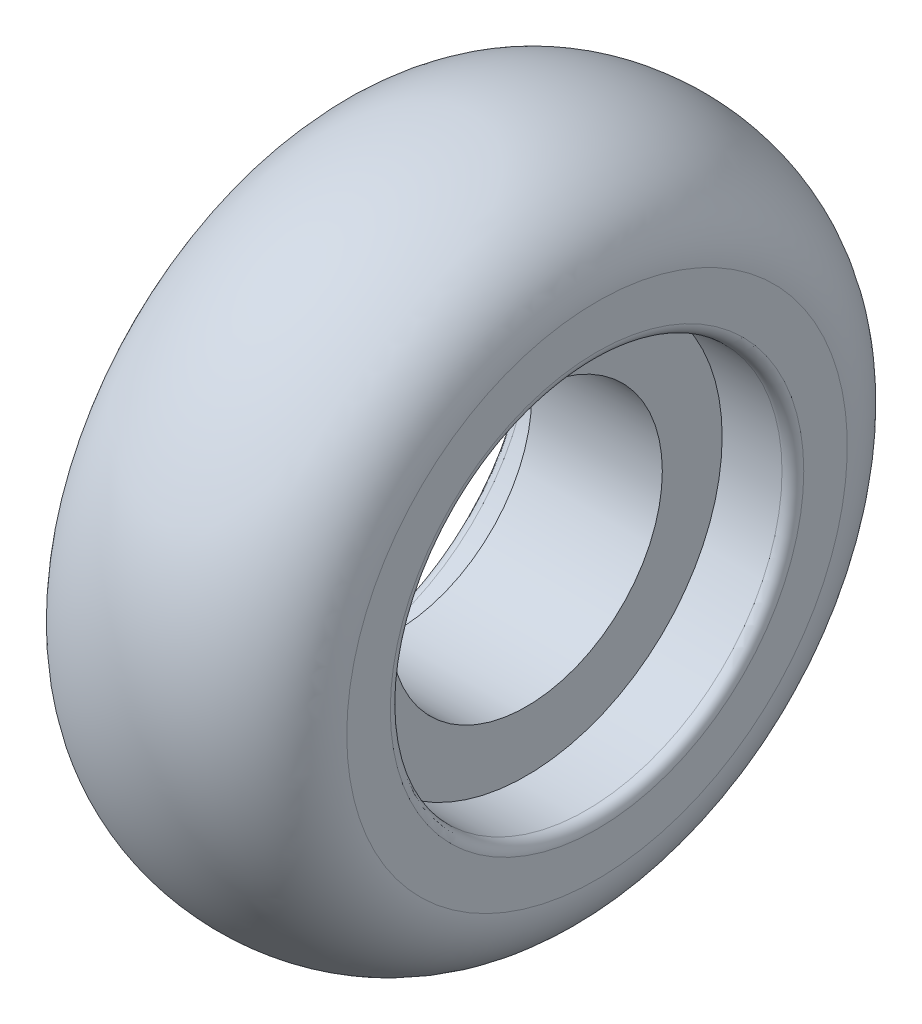
ISO-10303-21;
HEADER;
FILE_DESCRIPTION(('STEP AP214'),'2;1');
FILE_NAME('part.step','',(''),(''),'','','');
FILE_SCHEMA(('AUTOMOTIVE_DESIGN { 1 0 10303 214 1 1 1 1 }'));
ENDSEC;
DATA;
#1=APPLICATION_CONTEXT('core data for automotive mechanical design processes');
#2=APPLICATION_PROTOCOL_DEFINITION('international standard','automotive_design',2000,#1);
#3=PRODUCT_CONTEXT('',#1,'mechanical');
#4=PRODUCT('Part','Part','',(#3));
#5=PRODUCT_RELATED_PRODUCT_CATEGORY('part','',(#4));
#6=PRODUCT_DEFINITION_FORMATION('','',#4);
#7=PRODUCT_DEFINITION_CONTEXT('part definition',#1,'design');
#8=PRODUCT_DEFINITION('design','',#6,#7);
#9=PRODUCT_DEFINITION_SHAPE('','',#8);
#10=(LENGTH_UNIT() NAMED_UNIT(*) SI_UNIT(.MILLI.,.METRE.));
#11=(NAMED_UNIT(*) PLANE_ANGLE_UNIT() SI_UNIT($,.RADIAN.));
#12=(NAMED_UNIT(*) SI_UNIT($,.STERADIAN.) SOLID_ANGLE_UNIT());
#13=UNCERTAINTY_MEASURE_WITH_UNIT(LENGTH_MEASURE(1.E-05),#10,'distance_accuracy_value','');
#14=(GEOMETRIC_REPRESENTATION_CONTEXT(3) GLOBAL_UNCERTAINTY_ASSIGNED_CONTEXT((#13)) GLOBAL_UNIT_ASSIGNED_CONTEXT((#10,
#11,#12)) REPRESENTATION_CONTEXT('',''));
#15=CARTESIAN_POINT('',(0.,0.,0.));
#16=DIRECTION('',(0.,0.,1.));
#17=DIRECTION('',(1.,0.,0.));
#18=AXIS2_PLACEMENT_3D('',#15,#16,#17);
#19=CARTESIAN_POINT('',(6.,12.5,0.));
#20=DIRECTION('',(-1.,0.,0.));
#21=DIRECTION('',(0.,0.,1.));
#22=AXIS2_PLACEMENT_3D('',#19,#20,#21);
#23=PLANE('',#22);
#24=CARTESIAN_POINT('',(6.,0.,0.));
#25=DIRECTION('',(-1.,0.,0.));
#26=DIRECTION('',(0.,0.,1.));
#27=AXIS2_PLACEMENT_3D('',#24,#25,#26);
#28=CIRCLE('',#27,18.);
#29=CARTESIAN_POINT('',(6.,0.,18.));
#30=VERTEX_POINT('',#29);
#31=EDGE_CURVE('E10',#30,#30,#28,.T.);
#32=ORIENTED_EDGE('',*,*,#31,.F.);
#33=EDGE_LOOP('',(#32));
#34=FACE_BOUND('',#33,.T.);
#35=CARTESIAN_POINT('',(6.,0.,0.));
#36=DIRECTION('',(-1.,0.,0.));
#37=DIRECTION('',(0.,0.,1.));
#38=AXIS2_PLACEMENT_3D('',#35,#36,#37);
#39=CIRCLE('',#38,12.5);
#40=CARTESIAN_POINT('',(6.,0.,12.5));
#41=VERTEX_POINT('',#40);
#42=EDGE_CURVE('E67',#41,#41,#39,.T.);
#43=ORIENTED_EDGE('',*,*,#42,.T.);
#44=EDGE_LOOP('',(#43));
#45=FACE_BOUND('',#44,.T.);
#46=ADVANCED_FACE('F33',(#34,#45),#23,.F.);
#47=CARTESIAN_POINT('',(0.,0.,0.));
#48=DIRECTION('',(-1.,0.,0.));
#49=DIRECTION('',(0.,0.,1.));
#50=AXIS2_PLACEMENT_3D('',#47,#48,#49);
#51=CYLINDRICAL_SURFACE('',#50,18.);
#52=CARTESIAN_POINT('',(11.5,0.,0.));
#53=DIRECTION('',(-1.,0.,0.));
#54=DIRECTION('',(0.,0.,1.));
#55=AXIS2_PLACEMENT_3D('',#52,#53,#54);
#56=CIRCLE('',#55,18.);
#57=CARTESIAN_POINT('',(11.5,0.,18.));
#58=VERTEX_POINT('',#57);
#59=EDGE_CURVE('E39',#58,#58,#56,.T.);
#60=ORIENTED_EDGE('',*,*,#59,.F.);
#61=EDGE_LOOP('',(#60));
#62=FACE_BOUND('',#61,.T.);
#63=ORIENTED_EDGE('',*,*,#31,.T.);
#64=EDGE_LOOP('',(#63));
#65=FACE_BOUND('',#64,.T.);
#66=ADVANCED_FACE('F85',(#62,#65),#51,.F.);
#67=CARTESIAN_POINT('',(11.5,0.,0.));
#68=DIRECTION('',(-1.,0.,0.));
#69=DIRECTION('',(0.,0.,1.));
#70=AXIS2_PLACEMENT_3D('',#67,#68,#69);
#71=TOROIDAL_SURFACE('',#70,19.,1.);
#72=CARTESIAN_POINT('',(12.5,0.,0.));
#73=DIRECTION('',(-1.,0.,0.));
#74=DIRECTION('',(0.,0.,1.));
#75=AXIS2_PLACEMENT_3D('',#72,#73,#74);
#76=CIRCLE('',#75,19.);
#77=CARTESIAN_POINT('',(12.5,0.,19.));
#78=VERTEX_POINT('',#77);
#79=EDGE_CURVE('E43',#78,#78,#76,.T.);
#80=ORIENTED_EDGE('',*,*,#79,.F.);
#81=EDGE_LOOP('',(#80));
#82=FACE_BOUND('',#81,.T.);
#83=ORIENTED_EDGE('',*,*,#59,.T.);
#84=EDGE_LOOP('',(#83));
#85=FACE_BOUND('',#84,.T.);
#86=ADVANCED_FACE('F82',(#82,#85),#71,.T.);
#87=CARTESIAN_POINT('',(12.5,19.,0.));
#88=DIRECTION('',(-1.,0.,0.));
#89=DIRECTION('',(0.,0.,1.));
#90=AXIS2_PLACEMENT_3D('',#87,#88,#89);
#91=PLANE('',#90);
#92=CARTESIAN_POINT('',(12.5,0.,0.));
#93=DIRECTION('',(-1.,0.,0.));
#94=DIRECTION('',(0.,0.,1.));
#95=AXIS2_PLACEMENT_3D('',#92,#93,#94);
#96=CIRCLE('',#95,23.);
#97=CARTESIAN_POINT('',(12.5,0.,23.));
#98=VERTEX_POINT('',#97);
#99=EDGE_CURVE('E47',#98,#98,#96,.T.);
#100=ORIENTED_EDGE('',*,*,#99,.F.);
#101=EDGE_LOOP('',(#100));
#102=FACE_BOUND('',#101,.T.);
#103=ORIENTED_EDGE('',*,*,#79,.T.);
#104=EDGE_LOOP('',(#103));
#105=FACE_BOUND('',#104,.T.);
#106=ADVANCED_FACE('F77',(#102,#105),#91,.F.);
#107=CARTESIAN_POINT('',(0.,23.,0.));
#108=DIRECTION('',(0.,0.,1.));
#109=DIRECTION('',(1.,0.,0.));
#110=AXIS2_PLACEMENT_3D('',#107,#108,#109);
#111=ELLIPSE('',#110,12.5,8.5);
#112=CARTESIAN_POINT('',(0.,0.,0.));
#113=DIRECTION('',(-1.,0.,0.));
#114=AXIS1_PLACEMENT('',#112,#113);
#115=SURFACE_OF_REVOLUTION('',#111,#114);
#116=CARTESIAN_POINT('',(-12.5,0.,0.));
#117=DIRECTION('',(-1.,0.,0.));
#118=DIRECTION('',(0.,0.,1.));
#119=AXIS2_PLACEMENT_3D('',#116,#117,#118);
#120=CIRCLE('',#119,23.);
#121=CARTESIAN_POINT('',(-12.5,0.,23.));
#122=VERTEX_POINT('',#121);
#123=EDGE_CURVE('E52',#122,#122,#120,.T.);
#124=ORIENTED_EDGE('',*,*,#123,.F.);
#125=EDGE_LOOP('',(#124));
#126=FACE_BOUND('',#125,.T.);
#127=ORIENTED_EDGE('',*,*,#99,.T.);
#128=EDGE_LOOP('',(#127));
#129=FACE_BOUND('',#128,.T.);
#130=ADVANCED_FACE('F72',(#126,#129),#115,.T.);
#131=CARTESIAN_POINT('',(-12.5,19.,0.));
#132=DIRECTION('',(1.,0.,0.));
#133=DIRECTION('',(0.,0.,-1.));
#134=AXIS2_PLACEMENT_3D('',#131,#132,#133);
#135=PLANE('',#134);
#136=CARTESIAN_POINT('',(-12.5,0.,0.));
#137=DIRECTION('',(-1.,0.,0.));
#138=DIRECTION('',(0.,0.,1.));
#139=AXIS2_PLACEMENT_3D('',#136,#137,#138);
#140=CIRCLE('',#139,19.);
#141=CARTESIAN_POINT('',(-12.5,0.,19.));
#142=VERTEX_POINT('',#141);
#143=EDGE_CURVE('E55',#142,#142,#140,.T.);
#144=ORIENTED_EDGE('',*,*,#143,.F.);
#145=EDGE_LOOP('',(#144));
#146=FACE_BOUND('',#145,.T.);
#147=ORIENTED_EDGE('',*,*,#123,.T.);
#148=EDGE_LOOP('',(#147));
#149=FACE_BOUND('',#148,.T.);
#150=ADVANCED_FACE('F76',(#146,#149),#135,.F.);
#151=CARTESIAN_POINT('',(-11.5,0.,0.));
#152=DIRECTION('',(-1.,0.,0.));
#153=DIRECTION('',(0.,0.,1.));
#154=AXIS2_PLACEMENT_3D('',#151,#152,#153);
#155=TOROIDAL_SURFACE('',#154,19.,1.);
#156=CARTESIAN_POINT('',(-11.5,0.,0.));
#157=DIRECTION('',(-1.,0.,0.));
#158=DIRECTION('',(0.,0.,1.));
#159=AXIS2_PLACEMENT_3D('',#156,#157,#158);
#160=CIRCLE('',#159,18.);
#161=CARTESIAN_POINT('',(-11.5,0.,18.));
#162=VERTEX_POINT('',#161);
#163=EDGE_CURVE('E58',#162,#162,#160,.T.);
#164=ORIENTED_EDGE('',*,*,#163,.F.);
#165=EDGE_LOOP('',(#164));
#166=FACE_BOUND('',#165,.T.);
#167=ORIENTED_EDGE('',*,*,#143,.T.);
#168=EDGE_LOOP('',(#167));
#169=FACE_BOUND('',#168,.T.);
#170=ADVANCED_FACE('F113',(#166,#169),#155,.T.);
#171=CARTESIAN_POINT('',(0.,0.,0.));
#172=DIRECTION('',(-1.,0.,0.));
#173=DIRECTION('',(0.,0.,1.));
#174=AXIS2_PLACEMENT_3D('',#171,#172,#173);
#175=CYLINDRICAL_SURFACE('',#174,18.);
#176=CARTESIAN_POINT('',(-6.,0.,0.));
#177=DIRECTION('',(-1.,0.,0.));
#178=DIRECTION('',(0.,0.,1.));
#179=AXIS2_PLACEMENT_3D('',#176,#177,#178);
#180=CIRCLE('',#179,18.);
#181=CARTESIAN_POINT('',(-6.,0.,18.));
#182=VERTEX_POINT('',#181);
#183=EDGE_CURVE('E61',#182,#182,#180,.T.);
#184=ORIENTED_EDGE('',*,*,#183,.F.);
#185=EDGE_LOOP('',(#184));
#186=FACE_BOUND('',#185,.T.);
#187=ORIENTED_EDGE('',*,*,#163,.T.);
#188=EDGE_LOOP('',(#187));
#189=FACE_BOUND('',#188,.T.);
#190=ADVANCED_FACE('F107',(#186,#189),#175,.F.);
#191=CARTESIAN_POINT('',(-6.,12.5,0.));
#192=DIRECTION('',(1.,0.,0.));
#193=DIRECTION('',(0.,0.,-1.));
#194=AXIS2_PLACEMENT_3D('',#191,#192,#193);
#195=PLANE('',#194);
#196=CARTESIAN_POINT('',(-6.,0.,0.));
#197=DIRECTION('',(-1.,0.,0.));
#198=DIRECTION('',(0.,0.,1.));
#199=AXIS2_PLACEMENT_3D('',#196,#197,#198);
#200=CIRCLE('',#199,12.5);
#201=CARTESIAN_POINT('',(-6.,0.,12.5));
#202=VERTEX_POINT('',#201);
#203=EDGE_CURVE('E64',#202,#202,#200,.T.);
#204=ORIENTED_EDGE('',*,*,#203,.F.);
#205=EDGE_LOOP('',(#204));
#206=FACE_BOUND('',#205,.T.);
#207=ORIENTED_EDGE('',*,*,#183,.T.);
#208=EDGE_LOOP('',(#207));
#209=FACE_BOUND('',#208,.T.);
#210=ADVANCED_FACE('F101',(#206,#209),#195,.F.);
#211=CARTESIAN_POINT('',(0.,0.,0.));
#212=DIRECTION('',(-1.,0.,0.));
#213=DIRECTION('',(0.,0.,1.));
#214=AXIS2_PLACEMENT_3D('',#211,#212,#213);
#215=CYLINDRICAL_SURFACE('',#214,12.5);
#216=ORIENTED_EDGE('',*,*,#42,.F.);
#217=EDGE_LOOP('',(#216));
#218=FACE_BOUND('',#217,.T.);
#219=ORIENTED_EDGE('',*,*,#203,.T.);
#220=EDGE_LOOP('',(#219));
#221=FACE_BOUND('',#220,.T.);
#222=ADVANCED_FACE('F98',(#218,#221),#215,.F.);
#223=CLOSED_SHELL('',(#46,#66,#86,#106,#130,#150,#170,#190,#210,#222));
#224=MANIFOLD_SOLID_BREP('B2',#223);
#225=ADVANCED_BREP_SHAPE_REPRESENTATION('',(#18,#224),#14);
#226=SHAPE_DEFINITION_REPRESENTATION(#9,#225);
ENDSEC;
END-ISO-10303-21;
